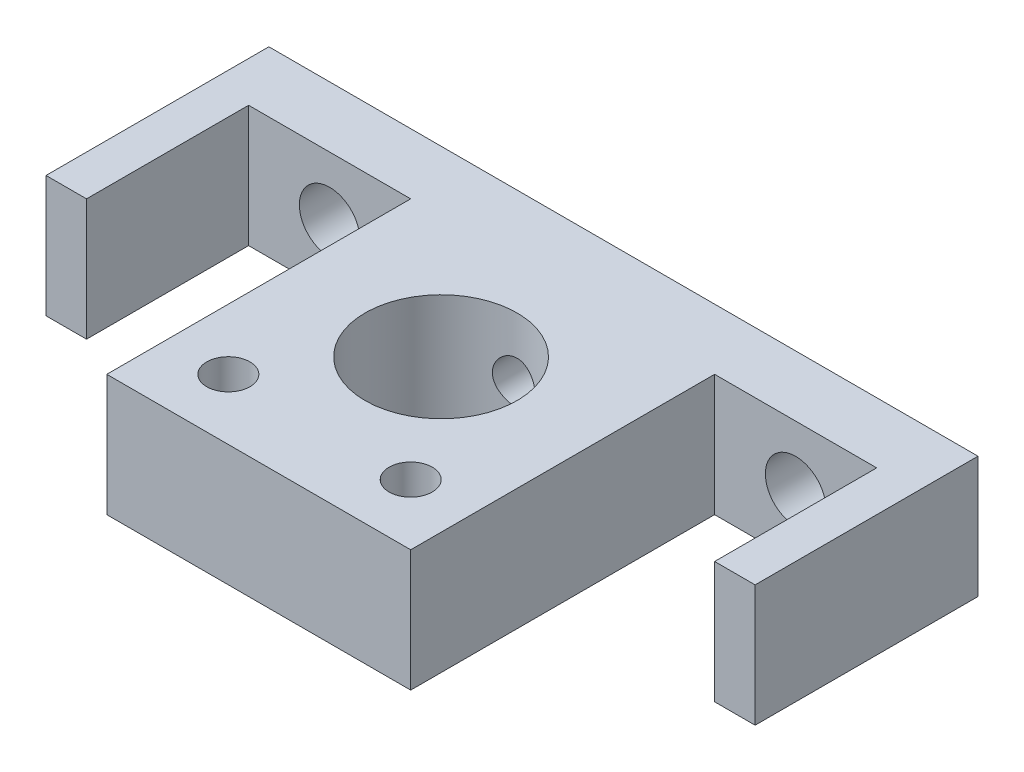
ISO-10303-21;
HEADER;
FILE_DESCRIPTION(('STEP AP214'),'2;1');
FILE_NAME('part.step','',(''),(''),'','','');
FILE_SCHEMA(('AUTOMOTIVE_DESIGN { 1 0 10303 214 1 1 1 1 }'));
ENDSEC;
DATA;
#1=APPLICATION_CONTEXT('core data for automotive mechanical design processes');
#2=APPLICATION_PROTOCOL_DEFINITION('international standard','automotive_design',2000,#1);
#3=PRODUCT_CONTEXT('',#1,'mechanical');
#4=PRODUCT('Part','Part','',(#3));
#5=PRODUCT_RELATED_PRODUCT_CATEGORY('part','',(#4));
#6=PRODUCT_DEFINITION_FORMATION('','',#4);
#7=PRODUCT_DEFINITION_CONTEXT('part definition',#1,'design');
#8=PRODUCT_DEFINITION('design','',#6,#7);
#9=PRODUCT_DEFINITION_SHAPE('','',#8);
#10=(LENGTH_UNIT() NAMED_UNIT(*) SI_UNIT(.MILLI.,.METRE.));
#11=(NAMED_UNIT(*) PLANE_ANGLE_UNIT() SI_UNIT($,.RADIAN.));
#12=(NAMED_UNIT(*) SI_UNIT($,.STERADIAN.) SOLID_ANGLE_UNIT());
#13=UNCERTAINTY_MEASURE_WITH_UNIT(LENGTH_MEASURE(1.E-05),#10,'distance_accuracy_value','');
#14=(GEOMETRIC_REPRESENTATION_CONTEXT(3) GLOBAL_UNCERTAINTY_ASSIGNED_CONTEXT((#13)) GLOBAL_UNIT_ASSIGNED_CONTEXT((#10,
#11,#12)) REPRESENTATION_CONTEXT('',''));
#15=CARTESIAN_POINT('',(0.,0.,0.));
#16=DIRECTION('',(0.,0.,1.));
#17=DIRECTION('',(1.,0.,0.));
#18=AXIS2_PLACEMENT_3D('',#15,#16,#17);
#19=CARTESIAN_POINT('',(-22.225,-0.001000000000001,-7.62));
#20=DIRECTION('',(0.,0.,-1.));
#21=DIRECTION('',(-1.,0.,0.));
#22=AXIS2_PLACEMENT_3D('',#19,#20,#21);
#23=PLANE('',#22);
#24=CARTESIAN_POINT('',(-14.605,3.81,-7.61999999999999));
#25=DIRECTION('',(0.,0.,1.));
#26=DIRECTION('',(1.,0.,0.));
#27=AXIS2_PLACEMENT_3D('',#24,#25,#26);
#28=CIRCLE('',#27,1.89865);
#29=CARTESIAN_POINT('',(-12.70635,3.81,-7.61999999999999));
#30=VERTEX_POINT('',#29);
#31=EDGE_CURVE('E226',#30,#30,#28,.T.);
#32=ORIENTED_EDGE('',*,*,#31,.F.);
#33=EDGE_LOOP('',(#32));
#34=FACE_BOUND('',#33,.T.);
#35=DIRECTION('',(0.,1.,0.));
#36=VECTOR('',#35,1.);
#37=CARTESIAN_POINT('',(-19.685,7.62,-7.61999999999999));
#38=LINE('',#37,#36);
#39=CARTESIAN_POINT('',(-19.685,0.,-7.61999999999999));
#40=VERTEX_POINT('',#39);
#41=CARTESIAN_POINT('',(-19.685,7.62,-7.61999999999999));
#42=VERTEX_POINT('',#41);
#43=EDGE_CURVE('E175',#40,#42,#38,.T.);
#44=ORIENTED_EDGE('',*,*,#43,.F.);
#45=DIRECTION('',(-1.,0.,0.));
#46=VECTOR('',#45,1.);
#47=CARTESIAN_POINT('',(-22.225,0.,-7.62));
#48=LINE('',#47,#46);
#49=CARTESIAN_POINT('',(-9.525,0.,-7.62));
#50=VERTEX_POINT('',#49);
#51=EDGE_CURVE('E238',#50,#40,#48,.T.);
#52=ORIENTED_EDGE('',*,*,#51,.F.);
#53=DIRECTION('',(0.,1.,0.));
#54=VECTOR('',#53,1.);
#55=CARTESIAN_POINT('',(-9.525,-0.001000000000001,-7.62));
#56=LINE('',#55,#54);
#57=CARTESIAN_POINT('',(-9.525,7.62,-7.62));
#58=VERTEX_POINT('',#57);
#59=EDGE_CURVE('E251',#50,#58,#56,.T.);
#60=ORIENTED_EDGE('',*,*,#59,.T.);
#61=DIRECTION('',(-1.,0.,0.));
#62=VECTOR('',#61,1.);
#63=CARTESIAN_POINT('',(-22.225,7.62,-7.62));
#64=LINE('',#63,#62);
#65=EDGE_CURVE('E246',#58,#42,#64,.T.);
#66=ORIENTED_EDGE('',*,*,#65,.T.);
#67=EDGE_LOOP('',(#44,#52,#60,#66));
#68=FACE_BOUND('',#67,.T.);
#69=ADVANCED_FACE('F43',(#34,#68),#23,.F.);
#70=CARTESIAN_POINT('',(0.,7.62,0.));
#71=DIRECTION('',(0.,-1.,0.));
#72=DIRECTION('',(0.,0.,-1.));
#73=AXIS2_PLACEMENT_3D('',#70,#71,#72);
#74=PLANE('',#73);
#75=CARTESIAN_POINT('',(-5.715,7.62,7.62));
#76=DIRECTION('',(0.,1.,0.));
#77=DIRECTION('',(0.,0.,1.));
#78=AXIS2_PLACEMENT_3D('',#75,#76,#77);
#79=CIRCLE('',#78,1.35254999999999);
#80=CARTESIAN_POINT('',(-5.715,7.62,8.97254999999999));
#81=VERTEX_POINT('',#80);
#82=EDGE_CURVE('E331',#81,#81,#79,.T.);
#83=ORIENTED_EDGE('',*,*,#82,.F.);
#84=EDGE_LOOP('',(#83));
#85=FACE_BOUND('',#84,.T.);
#86=CARTESIAN_POINT('',(5.715,7.62,7.62));
#87=DIRECTION('',(0.,1.,0.));
#88=DIRECTION('',(0.,0.,1.));
#89=AXIS2_PLACEMENT_3D('',#86,#87,#88);
#90=CIRCLE('',#89,1.35254999999999);
#91=CARTESIAN_POINT('',(5.715,7.62,8.97254999999999));
#92=VERTEX_POINT('',#91);
#93=EDGE_CURVE('E336',#92,#92,#90,.T.);
#94=ORIENTED_EDGE('',*,*,#93,.F.);
#95=EDGE_LOOP('',(#94));
#96=FACE_BOUND('',#95,.T.);
#97=CARTESIAN_POINT('',(0.,7.62,0.));
#98=DIRECTION('',(0.,1.,0.));
#99=DIRECTION('',(0.,0.,1.));
#100=AXIS2_PLACEMENT_3D('',#97,#98,#99);
#101=CIRCLE('',#100,4.7625);
#102=CARTESIAN_POINT('',(0.,7.62,4.7625));
#103=VERTEX_POINT('',#102);
#104=EDGE_CURVE('E270',#103,#103,#101,.T.);
#105=ORIENTED_EDGE('',*,*,#104,.F.);
#106=EDGE_LOOP('',(#105));
#107=FACE_BOUND('',#106,.T.);
#108=DIRECTION('',(0.,0.,-1.));
#109=VECTOR('',#108,1.);
#110=CARTESIAN_POINT('',(9.525,7.62,11.43));
#111=LINE('',#110,#109);
#112=CARTESIAN_POINT('',(9.525,7.62,11.43));
#113=VERTEX_POINT('',#112);
#114=CARTESIAN_POINT('',(9.525,7.62,-7.62));
#115=VERTEX_POINT('',#114);
#116=EDGE_CURVE('E214',#113,#115,#111,.T.);
#117=ORIENTED_EDGE('',*,*,#116,.T.);
#118=DIRECTION('',(1.,0.,0.));
#119=VECTOR('',#118,1.);
#120=CARTESIAN_POINT('',(22.225,7.62,-7.62));
#121=LINE('',#120,#119);
#122=CARTESIAN_POINT('',(19.685,7.62,-7.62));
#123=VERTEX_POINT('',#122);
#124=EDGE_CURVE('E211',#115,#123,#121,.T.);
#125=ORIENTED_EDGE('',*,*,#124,.T.);
#126=DIRECTION('',(0.,0.,-1.));
#127=VECTOR('',#126,1.);
#128=CARTESIAN_POINT('',(19.685,7.62,2.54));
#129=LINE('',#128,#127);
#130=CARTESIAN_POINT('',(19.685,7.62,2.54));
#131=VERTEX_POINT('',#130);
#132=EDGE_CURVE('E157',#131,#123,#129,.T.);
#133=ORIENTED_EDGE('',*,*,#132,.F.);
#134=DIRECTION('',(1.,0.,0.));
#135=VECTOR('',#134,1.);
#136=CARTESIAN_POINT('',(22.225,7.62,2.54));
#137=LINE('',#136,#135);
#138=CARTESIAN_POINT('',(22.225,7.62,2.54));
#139=VERTEX_POINT('',#138);
#140=EDGE_CURVE('E148',#131,#139,#137,.T.);
#141=ORIENTED_EDGE('',*,*,#140,.T.);
#142=DIRECTION('',(0.,0.,-1.));
#143=VECTOR('',#142,1.);
#144=CARTESIAN_POINT('',(22.225,7.62,11.43));
#145=LINE('',#144,#143);
#146=CARTESIAN_POINT('',(22.225,7.62,-11.43));
#147=VERTEX_POINT('',#146);
#148=EDGE_CURVE('E133',#139,#147,#145,.T.);
#149=ORIENTED_EDGE('',*,*,#148,.T.);
#150=DIRECTION('',(-1.,0.,0.));
#151=VECTOR('',#150,1.);
#152=CARTESIAN_POINT('',(-22.225,7.62,-11.43));
#153=LINE('',#152,#151);
#154=CARTESIAN_POINT('',(-22.225,7.62,-11.43));
#155=VERTEX_POINT('',#154);
#156=EDGE_CURVE('E141',#147,#155,#153,.T.);
#157=ORIENTED_EDGE('',*,*,#156,.T.);
#158=DIRECTION('',(0.,0.,1.));
#159=VECTOR('',#158,1.);
#160=CARTESIAN_POINT('',(-22.225,7.62,11.43));
#161=LINE('',#160,#159);
#162=CARTESIAN_POINT('',(-22.225,7.62,2.54));
#163=VERTEX_POINT('',#162);
#164=EDGE_CURVE('E367',#155,#163,#161,.T.);
#165=ORIENTED_EDGE('',*,*,#164,.T.);
#166=DIRECTION('',(-1.,0.,0.));
#167=VECTOR('',#166,1.);
#168=CARTESIAN_POINT('',(-22.225,7.62,2.54));
#169=LINE('',#168,#167);
#170=CARTESIAN_POINT('',(-19.685,7.62,2.54));
#171=VERTEX_POINT('',#170);
#172=EDGE_CURVE('E186',#171,#163,#169,.T.);
#173=ORIENTED_EDGE('',*,*,#172,.F.);
#174=DIRECTION('',(0.,0.,-1.));
#175=VECTOR('',#174,1.);
#176=CARTESIAN_POINT('',(-19.685,7.62,2.54));
#177=LINE('',#176,#175);
#178=EDGE_CURVE('E190',#171,#42,#177,.T.);
#179=ORIENTED_EDGE('',*,*,#178,.T.);
#180=ORIENTED_EDGE('',*,*,#65,.F.);
#181=DIRECTION('',(0.,0.,-1.));
#182=VECTOR('',#181,1.);
#183=CARTESIAN_POINT('',(-9.525,7.62,11.43));
#184=LINE('',#183,#182);
#185=CARTESIAN_POINT('',(-9.525,7.62,11.43));
#186=VERTEX_POINT('',#185);
#187=EDGE_CURVE('E242',#186,#58,#184,.T.);
#188=ORIENTED_EDGE('',*,*,#187,.F.);
#189=DIRECTION('',(1.,0.,0.));
#190=VECTOR('',#189,1.);
#191=CARTESIAN_POINT('',(-22.225,7.62,11.43));
#192=LINE('',#191,#190);
#193=EDGE_CURVE('E370',#186,#113,#192,.T.);
#194=ORIENTED_EDGE('',*,*,#193,.T.);
#195=EDGE_LOOP('',(#117,#125,#133,#141,#149,#157,#165,#173,#179,#180,#188,#194));
#196=FACE_BOUND('',#195,.T.);
#197=ADVANCED_FACE('F155',(#85,#96,#107,#196),#74,.F.);
#198=CARTESIAN_POINT('',(0.,0.,0.));
#199=DIRECTION('',(0.,-1.,0.));
#200=DIRECTION('',(0.,0.,-1.));
#201=AXIS2_PLACEMENT_3D('',#198,#199,#200);
#202=PLANE('',#201);
#203=CARTESIAN_POINT('',(-5.715,0.,7.62));
#204=DIRECTION('',(0.,1.,0.));
#205=DIRECTION('',(0.,0.,1.));
#206=AXIS2_PLACEMENT_3D('',#203,#204,#205);
#207=CIRCLE('',#206,1.35255);
#208=CARTESIAN_POINT('',(-5.715,0.,8.97255));
#209=VERTEX_POINT('',#208);
#210=EDGE_CURVE('E328',#209,#209,#207,.T.);
#211=ORIENTED_EDGE('',*,*,#210,.T.);
#212=EDGE_LOOP('',(#211));
#213=FACE_BOUND('',#212,.T.);
#214=CARTESIAN_POINT('',(5.715,0.,7.62));
#215=DIRECTION('',(0.,1.,0.));
#216=DIRECTION('',(0.,0.,1.));
#217=AXIS2_PLACEMENT_3D('',#214,#215,#216);
#218=CIRCLE('',#217,1.35255);
#219=CARTESIAN_POINT('',(5.715,0.,8.97255));
#220=VERTEX_POINT('',#219);
#221=EDGE_CURVE('E170',#220,#220,#218,.T.);
#222=ORIENTED_EDGE('',*,*,#221,.T.);
#223=EDGE_LOOP('',(#222));
#224=FACE_BOUND('',#223,.T.);
#225=CARTESIAN_POINT('',(0.,0.,0.));
#226=DIRECTION('',(0.,1.,0.));
#227=DIRECTION('',(0.,0.,1.));
#228=AXIS2_PLACEMENT_3D('',#225,#226,#227);
#229=CIRCLE('',#228,4.7625);
#230=CARTESIAN_POINT('',(0.,0.,4.7625));
#231=VERTEX_POINT('',#230);
#232=EDGE_CURVE('E269',#231,#231,#229,.T.);
#233=ORIENTED_EDGE('',*,*,#232,.T.);
#234=EDGE_LOOP('',(#233));
#235=FACE_BOUND('',#234,.T.);
#236=DIRECTION('',(1.,0.,0.));
#237=VECTOR('',#236,1.);
#238=CARTESIAN_POINT('',(22.225,0.,-7.62));
#239=LINE('',#238,#237);
#240=CARTESIAN_POINT('',(9.525,0.,-7.62));
#241=VERTEX_POINT('',#240);
#242=CARTESIAN_POINT('',(19.685,0.,-7.62));
#243=VERTEX_POINT('',#242);
#244=EDGE_CURVE('E64',#241,#243,#239,.T.);
#245=ORIENTED_EDGE('',*,*,#244,.F.);
#246=DIRECTION('',(0.,0.,-1.));
#247=VECTOR('',#246,1.);
#248=CARTESIAN_POINT('',(9.525,0.,11.43));
#249=LINE('',#248,#247);
#250=CARTESIAN_POINT('',(9.525,0.,11.43));
#251=VERTEX_POINT('',#250);
#252=EDGE_CURVE('E207',#251,#241,#249,.T.);
#253=ORIENTED_EDGE('',*,*,#252,.F.);
#254=DIRECTION('',(1.,0.,0.));
#255=VECTOR('',#254,1.);
#256=CARTESIAN_POINT('',(-22.225,0.,11.43));
#257=LINE('',#256,#255);
#258=CARTESIAN_POINT('',(-9.525,0.,11.43));
#259=VERTEX_POINT('',#258);
#260=EDGE_CURVE('E142',#259,#251,#257,.T.);
#261=ORIENTED_EDGE('',*,*,#260,.F.);
#262=DIRECTION('',(0.,0.,-1.));
#263=VECTOR('',#262,1.);
#264=CARTESIAN_POINT('',(-9.525,0.,11.43));
#265=LINE('',#264,#263);
#266=EDGE_CURVE('E234',#259,#50,#265,.T.);
#267=ORIENTED_EDGE('',*,*,#266,.T.);
#268=ORIENTED_EDGE('',*,*,#51,.T.);
#269=DIRECTION('',(0.,0.,-1.));
#270=VECTOR('',#269,1.);
#271=CARTESIAN_POINT('',(-19.685,0.,2.54));
#272=LINE('',#271,#270);
#273=CARTESIAN_POINT('',(-19.685,0.,2.54));
#274=VERTEX_POINT('',#273);
#275=EDGE_CURVE('E196',#274,#40,#272,.T.);
#276=ORIENTED_EDGE('',*,*,#275,.F.);
#277=DIRECTION('',(1.,0.,0.));
#278=VECTOR('',#277,1.);
#279=CARTESIAN_POINT('',(-22.225,0.,2.54));
#280=LINE('',#279,#278);
#281=CARTESIAN_POINT('',(-22.225,0.,2.54));
#282=VERTEX_POINT('',#281);
#283=EDGE_CURVE('E180',#282,#274,#280,.T.);
#284=ORIENTED_EDGE('',*,*,#283,.F.);
#285=DIRECTION('',(0.,0.,1.));
#286=VECTOR('',#285,1.);
#287=CARTESIAN_POINT('',(-22.225,0.,11.43));
#288=LINE('',#287,#286);
#289=CARTESIAN_POINT('',(-22.225,0.,-11.43));
#290=VERTEX_POINT('',#289);
#291=EDGE_CURVE('E376',#290,#282,#288,.T.);
#292=ORIENTED_EDGE('',*,*,#291,.F.);
#293=DIRECTION('',(-1.,0.,0.));
#294=VECTOR('',#293,1.);
#295=CARTESIAN_POINT('',(-22.225,0.,-11.43));
#296=LINE('',#295,#294);
#297=CARTESIAN_POINT('',(22.225,0.,-11.43));
#298=VERTEX_POINT('',#297);
#299=EDGE_CURVE('E360',#298,#290,#296,.T.);
#300=ORIENTED_EDGE('',*,*,#299,.F.);
#301=DIRECTION('',(0.,0.,-1.));
#302=VECTOR('',#301,1.);
#303=CARTESIAN_POINT('',(22.225,0.,11.43));
#304=LINE('',#303,#302);
#305=CARTESIAN_POINT('',(22.225,0.,2.54));
#306=VERTEX_POINT('',#305);
#307=EDGE_CURVE('E357',#306,#298,#304,.T.);
#308=ORIENTED_EDGE('',*,*,#307,.F.);
#309=DIRECTION('',(-1.,0.,0.));
#310=VECTOR('',#309,1.);
#311=CARTESIAN_POINT('',(22.225,0.,2.54));
#312=LINE('',#311,#310);
#313=CARTESIAN_POINT('',(19.685,0.,2.54));
#314=VERTEX_POINT('',#313);
#315=EDGE_CURVE('E151',#306,#314,#312,.T.);
#316=ORIENTED_EDGE('',*,*,#315,.T.);
#317=DIRECTION('',(0.,0.,-1.));
#318=VECTOR('',#317,1.);
#319=CARTESIAN_POINT('',(19.685,0.,2.54));
#320=LINE('',#319,#318);
#321=EDGE_CURVE('E167',#314,#243,#320,.T.);
#322=ORIENTED_EDGE('',*,*,#321,.T.);
#323=EDGE_LOOP('',(#245,#253,#261,#267,#268,#276,#284,#292,#300,#308,#316,#322));
#324=FACE_BOUND('',#323,.T.);
#325=ADVANCED_FACE('F345',(#213,#224,#235,#324),#202,.T.);
#326=CARTESIAN_POINT('',(22.225,7.62,11.43));
#327=DIRECTION('',(-1.,0.,0.));
#328=DIRECTION('',(0.,0.,1.));
#329=AXIS2_PLACEMENT_3D('',#326,#327,#328);
#330=PLANE('',#329);
#331=ORIENTED_EDGE('',*,*,#148,.F.);
#332=DIRECTION('',(0.,-1.,0.));
#333=VECTOR('',#332,1.);
#334=CARTESIAN_POINT('',(22.225,7.62,2.54));
#335=LINE('',#334,#333);
#336=EDGE_CURVE('E135',#139,#306,#335,.T.);
#337=ORIENTED_EDGE('',*,*,#336,.T.);
#338=ORIENTED_EDGE('',*,*,#307,.T.);
#339=DIRECTION('',(0.,-1.,0.));
#340=VECTOR('',#339,1.);
#341=CARTESIAN_POINT('',(22.225,7.62,-11.43));
#342=LINE('',#341,#340);
#343=EDGE_CURVE('E11',#147,#298,#342,.T.);
#344=ORIENTED_EDGE('',*,*,#343,.F.);
#345=EDGE_LOOP('',(#331,#337,#338,#344));
#346=FACE_BOUND('',#345,.T.);
#347=ADVANCED_FACE('F45',(#346),#330,.F.);
#348=CARTESIAN_POINT('',(-22.225,7.62,11.43));
#349=DIRECTION('',(0.,0.,-1.));
#350=DIRECTION('',(-1.,0.,0.));
#351=AXIS2_PLACEMENT_3D('',#348,#349,#350);
#352=PLANE('',#351);
#353=DIRECTION('',(0.,1.,0.));
#354=VECTOR('',#353,1.);
#355=CARTESIAN_POINT('',(9.525,-0.001000000000001,11.43));
#356=LINE('',#355,#354);
#357=EDGE_CURVE('E218',#251,#113,#356,.T.);
#358=ORIENTED_EDGE('',*,*,#357,.T.);
#359=ORIENTED_EDGE('',*,*,#193,.F.);
#360=DIRECTION('',(0.,1.,0.));
#361=VECTOR('',#360,1.);
#362=CARTESIAN_POINT('',(-9.525,-0.001000000000001,11.43));
#363=LINE('',#362,#361);
#364=EDGE_CURVE('E250',#259,#186,#363,.T.);
#365=ORIENTED_EDGE('',*,*,#364,.F.);
#366=ORIENTED_EDGE('',*,*,#260,.T.);
#367=EDGE_LOOP('',(#358,#359,#365,#366));
#368=FACE_BOUND('',#367,.T.);
#369=ADVANCED_FACE('F401',(#368),#352,.F.);
#370=CARTESIAN_POINT('',(-22.225,7.62,-11.43));
#371=DIRECTION('',(0.,0.,1.));
#372=DIRECTION('',(1.,0.,0.));
#373=AXIS2_PLACEMENT_3D('',#370,#371,#372);
#374=PLANE('',#373);
#375=CARTESIAN_POINT('',(14.605,3.81,-11.43));
#376=DIRECTION('',(0.,0.,1.));
#377=DIRECTION('',(1.,0.,0.));
#378=AXIS2_PLACEMENT_3D('',#375,#376,#377);
#379=CIRCLE('',#378,1.89865);
#380=CARTESIAN_POINT('',(16.50365,3.81,-11.43));
#381=VERTEX_POINT('',#380);
#382=EDGE_CURVE('E203',#381,#381,#379,.T.);
#383=ORIENTED_EDGE('',*,*,#382,.T.);
#384=EDGE_LOOP('',(#383));
#385=FACE_BOUND('',#384,.T.);
#386=CARTESIAN_POINT('',(-14.605,3.81,-11.43));
#387=DIRECTION('',(0.,0.,1.));
#388=DIRECTION('',(1.,0.,0.));
#389=AXIS2_PLACEMENT_3D('',#386,#387,#388);
#390=CIRCLE('',#389,1.89865);
#391=CARTESIAN_POINT('',(-12.70635,3.81,-11.43));
#392=VERTEX_POINT('',#391);
#393=EDGE_CURVE('E230',#392,#392,#390,.T.);
#394=ORIENTED_EDGE('',*,*,#393,.T.);
#395=EDGE_LOOP('',(#394));
#396=FACE_BOUND('',#395,.T.);
#397=ORIENTED_EDGE('',*,*,#299,.T.);
#398=DIRECTION('',(0.,-1.,0.));
#399=VECTOR('',#398,1.);
#400=CARTESIAN_POINT('',(-22.225,7.62,-11.43));
#401=LINE('',#400,#399);
#402=EDGE_CURVE('E52',#155,#290,#401,.T.);
#403=ORIENTED_EDGE('',*,*,#402,.F.);
#404=ORIENTED_EDGE('',*,*,#156,.F.);
#405=ORIENTED_EDGE('',*,*,#343,.T.);
#406=EDGE_LOOP('',(#397,#403,#404,#405));
#407=FACE_BOUND('',#406,.T.);
#408=CARTESIAN_POINT('',(0.,3.81,-11.43));
#409=DIRECTION('',(0.,0.,-1.));
#410=DIRECTION('',(-1.,0.,0.));
#411=AXIS2_PLACEMENT_3D('',#408,#409,#410);
#412=CIRCLE('',#411,1.35255);
#413=CARTESIAN_POINT('',(-1.35255,3.81,-11.43));
#414=VERTEX_POINT('',#413);
#415=EDGE_CURVE('E254',#414,#414,#412,.T.);
#416=ORIENTED_EDGE('',*,*,#415,.F.);
#417=EDGE_LOOP('',(#416));
#418=FACE_BOUND('',#417,.T.);
#419=ADVANCED_FACE('F398',(#385,#396,#407,#418),#374,.F.);
#420=CARTESIAN_POINT('',(-22.225,7.62,11.43));
#421=DIRECTION('',(1.,0.,0.));
#422=DIRECTION('',(0.,0.,-1.));
#423=AXIS2_PLACEMENT_3D('',#420,#421,#422);
#424=PLANE('',#423);
#425=ORIENTED_EDGE('',*,*,#291,.T.);
#426=DIRECTION('',(0.,-1.,0.));
#427=VECTOR('',#426,1.);
#428=CARTESIAN_POINT('',(-22.225,7.62,2.54));
#429=LINE('',#428,#427);
#430=EDGE_CURVE('E176',#163,#282,#429,.T.);
#431=ORIENTED_EDGE('',*,*,#430,.F.);
#432=ORIENTED_EDGE('',*,*,#164,.F.);
#433=ORIENTED_EDGE('',*,*,#402,.T.);
#434=EDGE_LOOP('',(#425,#431,#432,#433));
#435=FACE_BOUND('',#434,.T.);
#436=ADVANCED_FACE('F387',(#435),#424,.F.);
#437=CARTESIAN_POINT('',(0.,7.62,0.));
#438=DIRECTION('',(0.,-1.,0.));
#439=DIRECTION('',(0.,0.,-1.));
#440=AXIS2_PLACEMENT_3D('',#437,#438,#439);
#441=CYLINDRICAL_SURFACE('',#440,4.7625);
#442=CARTESIAN_POINT('',(0.,5.16255,-4.7625));
#443=CARTESIAN_POINT('',(-0.0743784999581472,5.1625486430201,-4.7624990905622));
#444=CARTESIAN_POINT('',(-0.148770997363665,5.15639427786598,-4.76074068414839));
#445=CARTESIAN_POINT('',(-0.295401048443409,5.13199047829311,-4.75389731213497));
#446=CARTESIAN_POINT('',(-0.367637754898101,5.11373635244937,-4.74881105624237));
#447=CARTESIAN_POINT('',(-0.5078193724622,5.06578329715905,-4.73587132206403));
#448=CARTESIAN_POINT('',(-0.575770075173447,5.03610021454009,-4.72802167664354));
#449=CARTESIAN_POINT('',(-0.705729564095678,4.96619378181307,-4.710377746781));
#450=CARTESIAN_POINT('',(-0.767737748085329,4.92596936497405,-4.70058326555549));
#451=CARTESIAN_POINT('',(-0.885664511249006,4.83501870977713,-4.67981587709255));
#452=CARTESIAN_POINT('',(-0.941406614739934,4.78406872941423,-4.66882075569231));
#453=CARTESIAN_POINT('',(-1.04368118906314,4.67359076612216,-4.64702871784162));
#454=CARTESIAN_POINT('',(-1.09021229789723,4.61406151685142,-4.63623183091725));
#455=CARTESIAN_POINT('',(-1.17363874376927,4.48666351744424,-4.61582763733192));
#456=CARTESIAN_POINT('',(-1.21032481599622,4.41865286087309,-4.60624815020734));
#457=CARTESIAN_POINT('',(-1.27166948775741,4.27711211694877,-4.58969276319239));
#458=CARTESIAN_POINT('',(-1.29633063999,4.20358320486075,-4.58271631079326));
#459=CARTESIAN_POINT('',(-1.3323006220351,4.05506189795207,-4.57238733366614));
#460=CARTESIAN_POINT('',(-1.34393220362154,3.98015390446938,-4.56894739365361));
#461=CARTESIAN_POINT('',(-1.35451996418055,3.8293768560357,-4.56582030437458));
#462=CARTESIAN_POINT('',(-1.35347886096571,3.75350801063768,-4.5661323504485));
#463=CARTESIAN_POINT('',(-1.33900564806272,3.60553442802031,-4.57039612187765));
#464=CARTESIAN_POINT('',(-1.32597092922696,3.53338691263082,-4.57423111302579));
#465=CARTESIAN_POINT('',(-1.28851978726118,3.39234778962324,-4.58492077482652));
#466=CARTESIAN_POINT('',(-1.26410234621991,3.323456473801,-4.59177571553807));
#467=CARTESIAN_POINT('',(-1.20427101589375,3.18988196332034,-4.60783068706061));
#468=CARTESIAN_POINT('',(-1.16872313756865,3.12526233362383,-4.61705903338387));
#469=CARTESIAN_POINT('',(-1.08773328002495,3.00276901838411,-4.63680661480737));
#470=CARTESIAN_POINT('',(-1.04228912138712,2.94489682311937,-4.64732613403454));
#471=CARTESIAN_POINT('',(-0.940794256967901,2.83527881637208,-4.66895040089115));
#472=CARTESIAN_POINT('',(-0.884411776618567,2.78384113440109,-4.68006235899327));
#473=CARTESIAN_POINT('',(-0.763683506834269,2.691083587976,-4.701270538666));
#474=CARTESIAN_POINT('',(-0.699337314715695,2.64976423546827,-4.71136670882664));
#475=CARTESIAN_POINT('',(-0.563989221375798,2.57825494809201,-4.72948235962791));
#476=CARTESIAN_POINT('',(-0.49295283825666,2.54812712835502,-4.73749017851947));
#477=CARTESIAN_POINT('',(-0.346542575324877,2.50033374841148,-4.75044281323286));
#478=CARTESIAN_POINT('',(-0.271169780302288,2.4826650859767,-4.75538839149013));
#479=CARTESIAN_POINT('',(-0.120850696904539,2.4607900941737,-4.76154131476188));
#480=CARTESIAN_POINT('',(-0.0459699308038007,2.45616553193465,-4.76286475366233));
#481=CARTESIAN_POINT('',(0.103499566400341,2.45934628148552,-4.76196150939729));
#482=CARTESIAN_POINT('',(0.178088331040755,2.46715012119969,-4.75973524667437));
#483=CARTESIAN_POINT('',(0.323320333171316,2.49462538244712,-4.75205828854765));
#484=CARTESIAN_POINT('',(0.394012520550827,2.5140578995256,-4.74667254553646));
#485=CARTESIAN_POINT('',(0.531122495891909,2.56395641763358,-4.73329318241284));
#486=CARTESIAN_POINT('',(0.597539791066202,2.59442368801873,-4.72529926228568));
#487=CARTESIAN_POINT('',(0.7257962701469,2.66626494247286,-4.70732543764485));
#488=CARTESIAN_POINT('',(0.787506578464486,2.70785900781803,-4.6973065860586));
#489=CARTESIAN_POINT('',(0.903216277264467,2.80050128896996,-4.67643766201817));
#490=CARTESIAN_POINT('',(0.957213930011425,2.85155162943405,-4.66558740308336));
#491=CARTESIAN_POINT('',(1.0577689096824,2.96361713337727,-4.64384180185687));
#492=CARTESIAN_POINT('',(1.10402970104661,3.02490082578654,-4.6329563160084));
#493=CARTESIAN_POINT('',(1.18562443626754,3.15459581025901,-4.61275127903121));
#494=CARTESIAN_POINT('',(1.22095876925181,3.22300684837768,-4.60343167214174));
#495=CARTESIAN_POINT('',(1.27943864976602,3.36472431512764,-4.58752245180627));
#496=CARTESIAN_POINT('',(1.3026495237019,3.43800205720859,-4.58091824850396));
#497=CARTESIAN_POINT('',(1.33634832071344,3.58764418491539,-4.57120256609449));
#498=CARTESIAN_POINT('',(1.34684004147844,3.66400764216698,-4.5680900444605));
#499=CARTESIAN_POINT('',(1.35456349369031,3.81459566461426,-4.56580529583762));
#500=CARTESIAN_POINT('',(1.35227511990277,3.88879379693445,-4.56649045772405));
#501=CARTESIAN_POINT('',(1.33563291667447,4.03569987613526,-4.57138541209335));
#502=CARTESIAN_POINT('',(1.32127948086557,4.10840787155346,-4.57559508958619));
#503=CARTESIAN_POINT('',(1.28120938194407,4.24957466494029,-4.58697424833289));
#504=CARTESIAN_POINT('',(1.25560725829135,4.31806855721659,-4.5941138485776));
#505=CARTESIAN_POINT('',(1.19385511761934,4.44984262392983,-4.61054579052911));
#506=CARTESIAN_POINT('',(1.15770325253401,4.51312188239307,-4.61983850935274));
#507=CARTESIAN_POINT('',(1.07447772612258,4.63492910528391,-4.63991281967711));
#508=CARTESIAN_POINT('',(1.02708281091476,4.69323115248444,-4.65073344512606));
#509=CARTESIAN_POINT('',(0.92331087367047,4.8012102271965,-4.67244141501305));
#510=CARTESIAN_POINT('',(0.866931600829681,4.85088508684919,-4.68332877551092));
#511=CARTESIAN_POINT('',(0.745075103274015,4.94144175885675,-4.70427270151549));
#512=CARTESIAN_POINT('',(0.679404116686308,4.98206990505124,-4.71430135163212));
#513=CARTESIAN_POINT('',(0.54187924853466,5.05164775838159,-4.73207848194561));
#514=CARTESIAN_POINT('',(0.470028828292721,5.08060395236433,-4.73982822802492));
#515=CARTESIAN_POINT('',(0.332182453383483,5.12282989682263,-4.751335030315));
#516=CARTESIAN_POINT('',(0.266702044494608,5.13768750874605,-4.75548935771175));
#517=CARTESIAN_POINT('',(0.134151413500937,5.15754753056349,-4.76107207516973));
#518=CARTESIAN_POINT('',(0.0670813995808879,5.16255122384977,-4.76250082021498));
#519=CARTESIAN_POINT('',(0.,5.16255,-4.7625));
#520=B_SPLINE_CURVE_WITH_KNOTS('',3,(#442,#443,#444,#445,#446,#447,#448,#449,#450,#451,#452,
#453,#454,#455,#456,#457,#458,#459,#460,#461,#462,#463,#464,#465,#466,#467,#468,#469,#470,#471,
#472,#473,#474,#475,#476,#477,#478,#479,#480,#481,#482,#483,#484,#485,#486,#487,#488,#489,#490,
#491,#492,#493,#494,#495,#496,#497,#498,#499,#500,#501,#502,#503,#504,#505,#506,#507,#508,#509,
#510,#511,#512,#513,#514,#515,#516,#517,#518,#519),.UNSPECIFIED.,.T.,.F.,(4,2,2,2,2,2,2,2,2,2,2,
2,2,2,2,2,2,2,2,2,2,2,2,2,2,2,2,2,2,2,2,2,2,2,2,2,2,2,4),(0.,0.222889294304382,
0.445865059785243,0.66853276499121,0.891223011776167,1.11912484754546,1.34706035724664,
1.5795136457763,1.81191756668119,2.03842777803386,2.26488941235131,2.48410768184065,
2.70334555890311,2.92533126990746,3.14736591748721,3.3776632797834,3.60797229178431,
3.83954111207457,4.07105225324437,4.29505113405518,4.51902348540568,4.73854523915272,
4.95809225306819,5.18235198880407,5.40666217297808,5.63821506829868,5.86975971630009,
6.10004348477564,6.33025847809252,6.55188840440896,6.77351110016065,6.99292761660176,
7.21238259274195,7.43908482813347,7.66584394760145,7.89832815072563,8.13068296884128,
8.33173130329812,8.53275345112239),.UNSPECIFIED.);
#521=CARTESIAN_POINT('',(0.,5.16255,-4.7625));
#522=VERTEX_POINT('',#521);
#523=EDGE_CURVE('E260',#522,#522,#520,.T.);
#524=ORIENTED_EDGE('',*,*,#523,.F.);
#525=EDGE_LOOP('',(#524));
#526=FACE_BOUND('',#525,.T.);
#527=ORIENTED_EDGE('',*,*,#104,.T.);
#528=EDGE_LOOP('',(#527));
#529=FACE_BOUND('',#528,.T.);
#530=ORIENTED_EDGE('',*,*,#232,.F.);
#531=EDGE_LOOP('',(#530));
#532=FACE_BOUND('',#531,.T.);
#533=ADVANCED_FACE('F279',(#526,#529,#532),#441,.F.);
#534=CARTESIAN_POINT('',(0.,3.81,-11.43));
#535=DIRECTION('',(0.,0.,-1.));
#536=DIRECTION('',(-1.,0.,0.));
#537=AXIS2_PLACEMENT_3D('',#534,#535,#536);
#538=CYLINDRICAL_SURFACE('',#537,1.35255);
#539=ORIENTED_EDGE('',*,*,#415,.T.);
#540=EDGE_LOOP('',(#539));
#541=FACE_BOUND('',#540,.T.);
#542=ORIENTED_EDGE('',*,*,#523,.T.);
#543=EDGE_LOOP('',(#542));
#544=FACE_BOUND('',#543,.T.);
#545=ADVANCED_FACE('F274',(#541,#544),#538,.F.);
#546=CARTESIAN_POINT('',(-9.525,-0.001000000000001,11.43));
#547=DIRECTION('',(1.,0.,0.));
#548=DIRECTION('',(0.,0.,-1.));
#549=AXIS2_PLACEMENT_3D('',#546,#547,#548);
#550=PLANE('',#549);
#551=ORIENTED_EDGE('',*,*,#364,.T.);
#552=ORIENTED_EDGE('',*,*,#187,.T.);
#553=ORIENTED_EDGE('',*,*,#59,.F.);
#554=ORIENTED_EDGE('',*,*,#266,.F.);
#555=EDGE_LOOP('',(#551,#552,#553,#554));
#556=FACE_BOUND('',#555,.T.);
#557=ADVANCED_FACE('F278',(#556),#550,.F.);
#558=CARTESIAN_POINT('',(-14.605,3.81,-7.61999999999999));
#559=DIRECTION('',(0.,0.,1.));
#560=DIRECTION('',(1.,0.,0.));
#561=AXIS2_PLACEMENT_3D('',#558,#559,#560);
#562=CYLINDRICAL_SURFACE('',#561,1.89865);
#563=ORIENTED_EDGE('',*,*,#393,.F.);
#564=EDGE_LOOP('',(#563));
#565=FACE_BOUND('',#564,.T.);
#566=ORIENTED_EDGE('',*,*,#31,.T.);
#567=EDGE_LOOP('',(#566));
#568=FACE_BOUND('',#567,.T.);
#569=ADVANCED_FACE('F283',(#565,#568),#562,.F.);
#570=CARTESIAN_POINT('',(9.525,-0.001000000000001,11.43));
#571=DIRECTION('',(1.,0.,0.));
#572=DIRECTION('',(0.,0.,-1.));
#573=AXIS2_PLACEMENT_3D('',#570,#571,#572);
#574=PLANE('',#573);
#575=ORIENTED_EDGE('',*,*,#252,.T.);
#576=DIRECTION('',(0.,1.,0.));
#577=VECTOR('',#576,1.);
#578=CARTESIAN_POINT('',(9.525,-0.001000000000001,-7.62));
#579=LINE('',#578,#577);
#580=EDGE_CURVE('E217',#241,#115,#579,.T.);
#581=ORIENTED_EDGE('',*,*,#580,.T.);
#582=ORIENTED_EDGE('',*,*,#116,.F.);
#583=ORIENTED_EDGE('',*,*,#357,.F.);
#584=EDGE_LOOP('',(#575,#581,#582,#583));
#585=FACE_BOUND('',#584,.T.);
#586=ADVANCED_FACE('F290',(#585),#574,.T.);
#587=CARTESIAN_POINT('',(22.225,-0.001000000000001,-7.62));
#588=DIRECTION('',(0.,0.,1.));
#589=DIRECTION('',(1.,0.,0.));
#590=AXIS2_PLACEMENT_3D('',#587,#588,#589);
#591=PLANE('',#590);
#592=DIRECTION('',(0.,1.,0.));
#593=VECTOR('',#592,1.);
#594=CARTESIAN_POINT('',(19.685,7.62,-7.61999999999999));
#595=LINE('',#594,#593);
#596=EDGE_CURVE('E59',#243,#123,#595,.T.);
#597=ORIENTED_EDGE('',*,*,#596,.T.);
#598=ORIENTED_EDGE('',*,*,#124,.F.);
#599=ORIENTED_EDGE('',*,*,#580,.F.);
#600=ORIENTED_EDGE('',*,*,#244,.T.);
#601=EDGE_LOOP('',(#597,#598,#599,#600));
#602=FACE_BOUND('',#601,.T.);
#603=CARTESIAN_POINT('',(14.605,3.81,-7.61999999999999));
#604=DIRECTION('',(0.,0.,1.));
#605=DIRECTION('',(1.,0.,0.));
#606=AXIS2_PLACEMENT_3D('',#603,#604,#605);
#607=CIRCLE('',#606,1.89865);
#608=CARTESIAN_POINT('',(16.50365,3.81,-7.61999999999999));
#609=VERTEX_POINT('',#608);
#610=EDGE_CURVE('E199',#609,#609,#607,.T.);
#611=ORIENTED_EDGE('',*,*,#610,.F.);
#612=EDGE_LOOP('',(#611));
#613=FACE_BOUND('',#612,.T.);
#614=ADVANCED_FACE('F292',(#602,#613),#591,.T.);
#615=CARTESIAN_POINT('',(14.605,3.81,-7.61999999999999));
#616=DIRECTION('',(0.,0.,1.));
#617=DIRECTION('',(1.,0.,0.));
#618=AXIS2_PLACEMENT_3D('',#615,#616,#617);
#619=CYLINDRICAL_SURFACE('',#618,1.89865);
#620=ORIENTED_EDGE('',*,*,#382,.F.);
#621=EDGE_LOOP('',(#620));
#622=FACE_BOUND('',#621,.T.);
#623=ORIENTED_EDGE('',*,*,#610,.T.);
#624=EDGE_LOOP('',(#623));
#625=FACE_BOUND('',#624,.T.);
#626=ADVANCED_FACE('F295',(#622,#625),#619,.F.);
#627=CARTESIAN_POINT('',(-19.685,7.62,2.54));
#628=DIRECTION('',(-1.,0.,0.));
#629=DIRECTION('',(0.,0.,1.));
#630=AXIS2_PLACEMENT_3D('',#627,#628,#629);
#631=PLANE('',#630);
#632=ORIENTED_EDGE('',*,*,#43,.T.);
#633=ORIENTED_EDGE('',*,*,#178,.F.);
#634=DIRECTION('',(0.,1.,0.));
#635=VECTOR('',#634,1.);
#636=CARTESIAN_POINT('',(-19.685,7.62,2.54));
#637=LINE('',#636,#635);
#638=EDGE_CURVE('E183',#274,#171,#637,.T.);
#639=ORIENTED_EDGE('',*,*,#638,.F.);
#640=ORIENTED_EDGE('',*,*,#275,.T.);
#641=EDGE_LOOP('',(#632,#633,#639,#640));
#642=FACE_BOUND('',#641,.T.);
#643=ADVANCED_FACE('F301',(#642),#631,.F.);
#644=CARTESIAN_POINT('',(0.,0.,2.54));
#645=DIRECTION('',(0.,0.,1.));
#646=DIRECTION('',(1.,0.,0.));
#647=AXIS2_PLACEMENT_3D('',#644,#645,#646);
#648=PLANE('',#647);
#649=ORIENTED_EDGE('',*,*,#430,.T.);
#650=ORIENTED_EDGE('',*,*,#283,.T.);
#651=ORIENTED_EDGE('',*,*,#638,.T.);
#652=ORIENTED_EDGE('',*,*,#172,.T.);
#653=EDGE_LOOP('',(#649,#650,#651,#652));
#654=FACE_BOUND('',#653,.T.);
#655=ADVANCED_FACE('F305',(#654),#648,.T.);
#656=CARTESIAN_POINT('',(19.685,7.62,2.54));
#657=DIRECTION('',(-1.,0.,0.));
#658=DIRECTION('',(0.,0.,1.));
#659=AXIS2_PLACEMENT_3D('',#656,#657,#658);
#660=PLANE('',#659);
#661=ORIENTED_EDGE('',*,*,#596,.F.);
#662=ORIENTED_EDGE('',*,*,#321,.F.);
#663=DIRECTION('',(0.,1.,0.));
#664=VECTOR('',#663,1.);
#665=CARTESIAN_POINT('',(19.685,7.62,2.54));
#666=LINE('',#665,#664);
#667=EDGE_CURVE('E159',#314,#131,#666,.T.);
#668=ORIENTED_EDGE('',*,*,#667,.T.);
#669=ORIENTED_EDGE('',*,*,#132,.T.);
#670=EDGE_LOOP('',(#661,#662,#668,#669));
#671=FACE_BOUND('',#670,.T.);
#672=ADVANCED_FACE('F309',(#671),#660,.T.);
#673=CARTESIAN_POINT('',(0.,0.,2.54));
#674=DIRECTION('',(0.,0.,1.));
#675=DIRECTION('',(-1.,0.,0.));
#676=AXIS2_PLACEMENT_3D('',#673,#674,#675);
#677=PLANE('',#676);
#678=ORIENTED_EDGE('',*,*,#336,.F.);
#679=ORIENTED_EDGE('',*,*,#140,.F.);
#680=ORIENTED_EDGE('',*,*,#667,.F.);
#681=ORIENTED_EDGE('',*,*,#315,.F.);
#682=EDGE_LOOP('',(#678,#679,#680,#681));
#683=FACE_BOUND('',#682,.T.);
#684=ADVANCED_FACE('F146',(#683),#677,.T.);
#685=CARTESIAN_POINT('',(5.715,7.62,7.62));
#686=DIRECTION('',(0.,1.,0.));
#687=DIRECTION('',(0.,0.,1.));
#688=AXIS2_PLACEMENT_3D('',#685,#686,#687);
#689=CYLINDRICAL_SURFACE('',#688,1.35254999999999);
#690=ORIENTED_EDGE('',*,*,#221,.F.);
#691=EDGE_LOOP('',(#690));
#692=FACE_BOUND('',#691,.T.);
#693=ORIENTED_EDGE('',*,*,#93,.T.);
#694=EDGE_LOOP('',(#693));
#695=FACE_BOUND('',#694,.T.);
#696=ADVANCED_FACE('F316',(#692,#695),#689,.F.);
#697=CARTESIAN_POINT('',(-5.715,7.62,7.62));
#698=DIRECTION('',(0.,1.,0.));
#699=DIRECTION('',(0.,0.,1.));
#700=AXIS2_PLACEMENT_3D('',#697,#698,#699);
#701=CYLINDRICAL_SURFACE('',#700,1.35254999999999);
#702=ORIENTED_EDGE('',*,*,#210,.F.);
#703=EDGE_LOOP('',(#702));
#704=FACE_BOUND('',#703,.T.);
#705=ORIENTED_EDGE('',*,*,#82,.T.);
#706=EDGE_LOOP('',(#705));
#707=FACE_BOUND('',#706,.T.);
#708=ADVANCED_FACE('F319',(#704,#707),#701,.F.);
#709=CLOSED_SHELL('',(#69,#197,#325,#347,#369,#419,#436,#533,#545,#557,#569,#586,#614,#626,#643,
#655,#672,#684,#696,#708));
#710=MANIFOLD_SOLID_BREP('B2',#709);
#711=ADVANCED_BREP_SHAPE_REPRESENTATION('',(#18,#710),#14);
#712=SHAPE_DEFINITION_REPRESENTATION(#9,#711);
ENDSEC;
END-ISO-10303-21;
